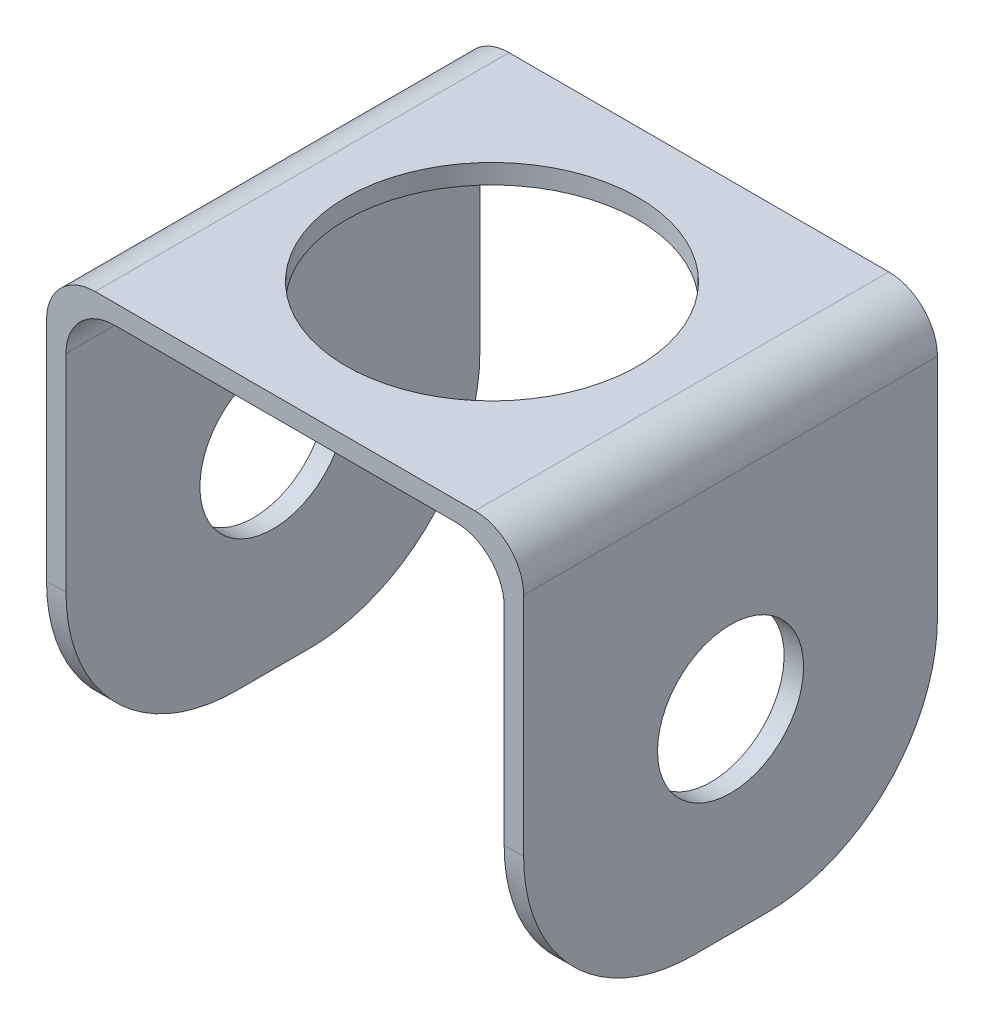
ISO-10303-21;
HEADER;
FILE_DESCRIPTION(('STEP AP214'),'2;1');
FILE_NAME('part.step','',(''),(''),'','','');
FILE_SCHEMA(('AUTOMOTIVE_DESIGN { 1 0 10303 214 1 1 1 1 }'));
ENDSEC;
DATA;
#1=APPLICATION_CONTEXT('core data for automotive mechanical design processes');
#2=APPLICATION_PROTOCOL_DEFINITION('international standard','automotive_design',2000,#1);
#3=PRODUCT_CONTEXT('',#1,'mechanical');
#4=PRODUCT('Part','Part','',(#3));
#5=PRODUCT_RELATED_PRODUCT_CATEGORY('part','',(#4));
#6=PRODUCT_DEFINITION_FORMATION('','',#4);
#7=PRODUCT_DEFINITION_CONTEXT('part definition',#1,'design');
#8=PRODUCT_DEFINITION('design','',#6,#7);
#9=PRODUCT_DEFINITION_SHAPE('','',#8);
#10=(LENGTH_UNIT() NAMED_UNIT(*) SI_UNIT(.MILLI.,.METRE.));
#11=(NAMED_UNIT(*) PLANE_ANGLE_UNIT() SI_UNIT($,.RADIAN.));
#12=(NAMED_UNIT(*) SI_UNIT($,.STERADIAN.) SOLID_ANGLE_UNIT());
#13=UNCERTAINTY_MEASURE_WITH_UNIT(LENGTH_MEASURE(1.E-05),#10,'distance_accuracy_value','');
#14=(GEOMETRIC_REPRESENTATION_CONTEXT(3) GLOBAL_UNCERTAINTY_ASSIGNED_CONTEXT((#13)) GLOBAL_UNIT_ASSIGNED_CONTEXT((#10,
#11,#12)) REPRESENTATION_CONTEXT('',''));
#15=CARTESIAN_POINT('',(0.,0.,0.));
#16=DIRECTION('',(0.,0.,1.));
#17=DIRECTION('',(1.,0.,0.));
#18=AXIS2_PLACEMENT_3D('',#15,#16,#17);
#19=CARTESIAN_POINT('',(-180.,0.,170.));
#20=DIRECTION('',(-1.,0.,0.));
#21=DIRECTION('',(0.,0.,1.));
#22=AXIS2_PLACEMENT_3D('',#19,#20,#21);
#23=PLANE('',#22);
#24=CARTESIAN_POINT('',(-180.,-95.,85.));
#25=DIRECTION('',(-1.,0.,0.));
#26=DIRECTION('',(0.,0.,1.));
#27=AXIS2_PLACEMENT_3D('',#24,#25,#26);
#28=CIRCLE('',#27,30.);
#29=CARTESIAN_POINT('',(-180.,-95.,115.));
#30=VERTEX_POINT('',#29);
#31=EDGE_CURVE('E490',#30,#30,#28,.T.);
#32=ORIENTED_EDGE('',*,*,#31,.T.);
#33=EDGE_LOOP('',(#32));
#34=FACE_BOUND('',#33,.T.);
#35=DIRECTION('',(0.,1.,0.));
#36=VECTOR('',#35,1.);
#37=CARTESIAN_POINT('',(-180.,0.,0.));
#38=LINE('',#37,#36);
#39=CARTESIAN_POINT('',(-180.,-105.,0.));
#40=VERTEX_POINT('',#39);
#41=CARTESIAN_POINT('',(-180.,-20.,0.));
#42=VERTEX_POINT('',#41);
#43=EDGE_CURVE('E193',#40,#42,#38,.T.);
#44=ORIENTED_EDGE('',*,*,#43,.T.);
#45=DIRECTION('',(0.,0.,-1.));
#46=VECTOR('',#45,1.);
#47=CARTESIAN_POINT('',(-180.,-20.,170.));
#48=LINE('',#47,#46);
#49=CARTESIAN_POINT('',(-180.,-20.,170.));
#50=VERTEX_POINT('',#49);
#51=EDGE_CURVE('E173',#42,#50,#48,.F.);
#52=ORIENTED_EDGE('',*,*,#51,.T.);
#53=DIRECTION('',(0.,1.,0.));
#54=VECTOR('',#53,1.);
#55=CARTESIAN_POINT('',(-180.,0.,170.));
#56=LINE('',#55,#54);
#57=CARTESIAN_POINT('',(-180.,-105.,170.));
#58=VERTEX_POINT('',#57);
#59=EDGE_CURVE('E165',#58,#50,#56,.T.);
#60=ORIENTED_EDGE('',*,*,#59,.F.);
#61=CARTESIAN_POINT('',(-180.,-105.,100.));
#62=DIRECTION('',(-1.,0.,0.));
#63=DIRECTION('',(0.,0.,1.));
#64=AXIS2_PLACEMENT_3D('',#61,#62,#63);
#65=CIRCLE('',#64,70.);
#66=CARTESIAN_POINT('',(-180.,-175.,100.));
#67=VERTEX_POINT('',#66);
#68=EDGE_CURVE('E150',#58,#67,#65,.F.);
#69=ORIENTED_EDGE('',*,*,#68,.T.);
#70=DIRECTION('',(0.,0.,-1.));
#71=VECTOR('',#70,1.);
#72=CARTESIAN_POINT('',(-180.,-175.,170.));
#73=LINE('',#72,#71);
#74=CARTESIAN_POINT('',(-180.,-175.,70.));
#75=VERTEX_POINT('',#74);
#76=EDGE_CURVE('E192',#67,#75,#73,.T.);
#77=ORIENTED_EDGE('',*,*,#76,.T.);
#78=CARTESIAN_POINT('',(-180.,-105.,70.));
#79=DIRECTION('',(-1.,0.,0.));
#80=DIRECTION('',(0.,0.,1.));
#81=AXIS2_PLACEMENT_3D('',#78,#79,#80);
#82=CIRCLE('',#81,70.);
#83=EDGE_CURVE('E161',#75,#40,#82,.F.);
#84=ORIENTED_EDGE('',*,*,#83,.T.);
#85=EDGE_LOOP('',(#44,#52,#60,#69,#77,#84));
#86=FACE_BOUND('',#85,.T.);
#87=ADVANCED_FACE('F34',(#34,#86),#23,.F.);
#88=CARTESIAN_POINT('',(-180.,0.,170.));
#89=DIRECTION('',(0.,1.,0.));
#90=DIRECTION('',(0.,0.,1.));
#91=AXIS2_PLACEMENT_3D('',#88,#89,#90);
#92=PLANE('',#91);
#93=CARTESIAN_POINT('',(-90.,0.,85.));
#94=DIRECTION('',(0.,1.,0.));
#95=DIRECTION('',(0.,0.,1.));
#96=AXIS2_PLACEMENT_3D('',#93,#94,#95);
#97=CIRCLE('',#96,60.);
#98=CARTESIAN_POINT('',(-150.,0.,85.));
#99=VERTEX_POINT('',#98);
#100=EDGE_CURVE('E183',#99,#99,#97,.T.);
#101=ORIENTED_EDGE('',*,*,#100,.T.);
#102=EDGE_LOOP('',(#101));
#103=FACE_BOUND('',#102,.T.);
#104=DIRECTION('',(1.,0.,0.));
#105=VECTOR('',#104,1.);
#106=CARTESIAN_POINT('',(-180.,0.,170.));
#107=LINE('',#106,#105);
#108=CARTESIAN_POINT('',(-160.,0.,170.));
#109=VERTEX_POINT('',#108);
#110=CARTESIAN_POINT('',(-20.,0.,170.));
#111=VERTEX_POINT('',#110);
#112=EDGE_CURVE('E174',#109,#111,#107,.T.);
#113=ORIENTED_EDGE('',*,*,#112,.F.);
#114=DIRECTION('',(0.,0.,-1.));
#115=VECTOR('',#114,1.);
#116=CARTESIAN_POINT('',(-160.,0.,0.));
#117=LINE('',#116,#115);
#118=CARTESIAN_POINT('',(-160.,0.,0.));
#119=VERTEX_POINT('',#118);
#120=EDGE_CURVE('E246',#109,#119,#117,.T.);
#121=ORIENTED_EDGE('',*,*,#120,.T.);
#122=DIRECTION('',(1.,0.,0.));
#123=VECTOR('',#122,1.);
#124=CARTESIAN_POINT('',(-180.,0.,0.));
#125=LINE('',#124,#123);
#126=CARTESIAN_POINT('',(-20.,0.,0.));
#127=VERTEX_POINT('',#126);
#128=EDGE_CURVE('E195',#119,#127,#125,.T.);
#129=ORIENTED_EDGE('',*,*,#128,.T.);
#130=DIRECTION('',(0.,0.,-1.));
#131=VECTOR('',#130,1.);
#132=CARTESIAN_POINT('',(-20.,0.,170.));
#133=LINE('',#132,#131);
#134=EDGE_CURVE('E244',#127,#111,#133,.F.);
#135=ORIENTED_EDGE('',*,*,#134,.T.);
#136=EDGE_LOOP('',(#113,#121,#129,#135));
#137=FACE_BOUND('',#136,.T.);
#138=ADVANCED_FACE('F310',(#103,#137),#92,.F.);
#139=CARTESIAN_POINT('',(0.,0.,170.));
#140=DIRECTION('',(1.,0.,0.));
#141=DIRECTION('',(0.,1.,0.));
#142=AXIS2_PLACEMENT_3D('',#139,#140,#141);
#143=PLANE('',#142);
#144=CARTESIAN_POINT('',(0.,-95.,85.));
#145=DIRECTION('',(1.,0.,0.));
#146=DIRECTION('',(0.,1.,0.));
#147=AXIS2_PLACEMENT_3D('',#144,#145,#146);
#148=CIRCLE('',#147,30.);
#149=CARTESIAN_POINT('',(0.,-65.,85.));
#150=VERTEX_POINT('',#149);
#151=EDGE_CURVE('E492',#150,#150,#148,.T.);
#152=ORIENTED_EDGE('',*,*,#151,.T.);
#153=EDGE_LOOP('',(#152));
#154=FACE_BOUND('',#153,.T.);
#155=DIRECTION('',(0.,-1.,0.));
#156=VECTOR('',#155,1.);
#157=CARTESIAN_POINT('',(0.,0.,170.));
#158=LINE('',#157,#156);
#159=CARTESIAN_POINT('',(0.,-20.,170.));
#160=VERTEX_POINT('',#159);
#161=CARTESIAN_POINT('',(0.,-105.,170.));
#162=VERTEX_POINT('',#161);
#163=EDGE_CURVE('E178',#160,#162,#158,.T.);
#164=ORIENTED_EDGE('',*,*,#163,.F.);
#165=DIRECTION('',(0.,0.,-1.));
#166=VECTOR('',#165,1.);
#167=CARTESIAN_POINT('',(0.,-20.,0.));
#168=LINE('',#167,#166);
#169=CARTESIAN_POINT('',(0.,-20.,0.));
#170=VERTEX_POINT('',#169);
#171=EDGE_CURVE('E250',#160,#170,#168,.T.);
#172=ORIENTED_EDGE('',*,*,#171,.T.);
#173=DIRECTION('',(0.,-1.,0.));
#174=VECTOR('',#173,1.);
#175=CARTESIAN_POINT('',(0.,0.,0.));
#176=LINE('',#175,#174);
#177=CARTESIAN_POINT('',(0.,-105.,0.));
#178=VERTEX_POINT('',#177);
#179=EDGE_CURVE('E198',#170,#178,#176,.T.);
#180=ORIENTED_EDGE('',*,*,#179,.T.);
#181=CARTESIAN_POINT('',(0.,-105.,70.));
#182=DIRECTION('',(1.,0.,0.));
#183=DIRECTION('',(0.,1.,0.));
#184=AXIS2_PLACEMENT_3D('',#181,#182,#183);
#185=CIRCLE('',#184,70.);
#186=CARTESIAN_POINT('',(0.,-175.,70.));
#187=VERTEX_POINT('',#186);
#188=EDGE_CURVE('E242',#178,#187,#185,.F.);
#189=ORIENTED_EDGE('',*,*,#188,.T.);
#190=DIRECTION('',(0.,0.,-1.));
#191=VECTOR('',#190,1.);
#192=CARTESIAN_POINT('',(0.,-175.,170.));
#193=LINE('',#192,#191);
#194=CARTESIAN_POINT('',(0.,-175.,100.));
#195=VERTEX_POINT('',#194);
#196=EDGE_CURVE('E211',#195,#187,#193,.T.);
#197=ORIENTED_EDGE('',*,*,#196,.F.);
#198=CARTESIAN_POINT('',(0.,-105.,100.));
#199=DIRECTION('',(1.,0.,0.));
#200=DIRECTION('',(0.,1.,0.));
#201=AXIS2_PLACEMENT_3D('',#198,#199,#200);
#202=CIRCLE('',#201,70.);
#203=EDGE_CURVE('E239',#195,#162,#202,.F.);
#204=ORIENTED_EDGE('',*,*,#203,.T.);
#205=EDGE_LOOP('',(#164,#172,#180,#189,#197,#204));
#206=FACE_BOUND('',#205,.T.);
#207=ADVANCED_FACE('F297',(#154,#206),#143,.F.);
#208=CARTESIAN_POINT('',(0.,-175.,170.));
#209=DIRECTION('',(0.,1.,0.));
#210=DIRECTION('',(0.,0.,1.));
#211=AXIS2_PLACEMENT_3D('',#208,#209,#210);
#212=PLANE('',#211);
#213=ORIENTED_EDGE('',*,*,#196,.T.);
#214=DIRECTION('',(1.,0.,0.));
#215=VECTOR('',#214,1.);
#216=CARTESIAN_POINT('',(8.00000000000002,-175.,70.));
#217=LINE('',#216,#215);
#218=CARTESIAN_POINT('',(8.00000000000002,-175.,70.));
#219=VERTEX_POINT('',#218);
#220=EDGE_CURVE('E232',#187,#219,#217,.T.);
#221=ORIENTED_EDGE('',*,*,#220,.T.);
#222=DIRECTION('',(0.,0.,-1.));
#223=VECTOR('',#222,1.);
#224=CARTESIAN_POINT('',(8.00000000000002,-175.,170.));
#225=LINE('',#224,#223);
#226=CARTESIAN_POINT('',(8.00000000000002,-175.,100.));
#227=VERTEX_POINT('',#226);
#228=EDGE_CURVE('E208',#227,#219,#225,.T.);
#229=ORIENTED_EDGE('',*,*,#228,.F.);
#230=DIRECTION('',(1.,0.,0.));
#231=VECTOR('',#230,1.);
#232=CARTESIAN_POINT('',(0.,-175.,100.));
#233=LINE('',#232,#231);
#234=EDGE_CURVE('E230',#227,#195,#233,.F.);
#235=ORIENTED_EDGE('',*,*,#234,.T.);
#236=EDGE_LOOP('',(#213,#221,#229,#235));
#237=FACE_BOUND('',#236,.T.);
#238=ADVANCED_FACE('F291',(#237),#212,.F.);
#239=CARTESIAN_POINT('',(8.00000000000002,-175.,170.));
#240=DIRECTION('',(-1.,0.,0.));
#241=DIRECTION('',(0.,-1.,0.));
#242=AXIS2_PLACEMENT_3D('',#239,#240,#241);
#243=PLANE('',#242);
#244=CARTESIAN_POINT('',(8.00000000000001,-95.,85.));
#245=DIRECTION('',(-1.,0.,0.));
#246=DIRECTION('',(0.,-1.,0.));
#247=AXIS2_PLACEMENT_3D('',#244,#245,#246);
#248=CIRCLE('',#247,30.);
#249=CARTESIAN_POINT('',(8.00000000000001,-125.,85.));
#250=VERTEX_POINT('',#249);
#251=EDGE_CURVE('E496',#250,#250,#248,.T.);
#252=ORIENTED_EDGE('',*,*,#251,.T.);
#253=EDGE_LOOP('',(#252));
#254=FACE_BOUND('',#253,.T.);
#255=DIRECTION('',(0.,1.,0.));
#256=VECTOR('',#255,1.);
#257=CARTESIAN_POINT('',(8.00000000000002,-175.,0.));
#258=LINE('',#257,#256);
#259=CARTESIAN_POINT('',(8.00000000000002,-105.,0.));
#260=VERTEX_POINT('',#259);
#261=CARTESIAN_POINT('',(8.00000000000001,-12.,0.));
#262=VERTEX_POINT('',#261);
#263=EDGE_CURVE('E200',#260,#262,#258,.T.);
#264=ORIENTED_EDGE('',*,*,#263,.T.);
#265=DIRECTION('',(0.,0.,-1.));
#266=VECTOR('',#265,1.);
#267=CARTESIAN_POINT('',(8.00000000000001,-12.,170.));
#268=LINE('',#267,#266);
#269=CARTESIAN_POINT('',(8.00000000000001,-12.,170.));
#270=VERTEX_POINT('',#269);
#271=EDGE_CURVE('E57',#262,#270,#268,.F.);
#272=ORIENTED_EDGE('',*,*,#271,.T.);
#273=DIRECTION('',(0.,1.,0.));
#274=VECTOR('',#273,1.);
#275=CARTESIAN_POINT('',(8.00000000000002,-175.,170.));
#276=LINE('',#275,#274);
#277=CARTESIAN_POINT('',(8.00000000000002,-105.,170.));
#278=VERTEX_POINT('',#277);
#279=EDGE_CURVE('E187',#278,#270,#276,.T.);
#280=ORIENTED_EDGE('',*,*,#279,.F.);
#281=CARTESIAN_POINT('',(8.00000000000002,-105.,100.));
#282=DIRECTION('',(-1.,0.,0.));
#283=DIRECTION('',(0.,-1.,0.));
#284=AXIS2_PLACEMENT_3D('',#281,#282,#283);
#285=CIRCLE('',#284,70.);
#286=EDGE_CURVE('E235',#278,#227,#285,.F.);
#287=ORIENTED_EDGE('',*,*,#286,.T.);
#288=ORIENTED_EDGE('',*,*,#228,.T.);
#289=CARTESIAN_POINT('',(8.00000000000002,-105.,70.));
#290=DIRECTION('',(-1.,0.,0.));
#291=DIRECTION('',(0.,-1.,0.));
#292=AXIS2_PLACEMENT_3D('',#289,#290,#291);
#293=CIRCLE('',#292,70.);
#294=EDGE_CURVE('E237',#219,#260,#293,.F.);
#295=ORIENTED_EDGE('',*,*,#294,.T.);
#296=EDGE_LOOP('',(#264,#272,#280,#287,#288,#295));
#297=FACE_BOUND('',#296,.T.);
#298=ADVANCED_FACE('F284',(#254,#297),#243,.F.);
#299=CARTESIAN_POINT('',(-180.,7.99999999999998,170.));
#300=DIRECTION('',(0.,-1.,0.));
#301=DIRECTION('',(1.,0.,0.));
#302=AXIS2_PLACEMENT_3D('',#299,#300,#301);
#303=PLANE('',#302);
#304=CARTESIAN_POINT('',(-90.,8.00000000000001,85.));
#305=DIRECTION('',(0.,1.,0.));
#306=DIRECTION('',(-1.,0.,0.));
#307=AXIS2_PLACEMENT_3D('',#304,#305,#306);
#308=CIRCLE('',#307,60.);
#309=CARTESIAN_POINT('',(-150.,8.00000000000004,85.));
#310=VERTEX_POINT('',#309);
#311=EDGE_CURVE('E491',#310,#310,#308,.T.);
#312=ORIENTED_EDGE('',*,*,#311,.F.);
#313=EDGE_LOOP('',(#312));
#314=FACE_BOUND('',#313,.T.);
#315=DIRECTION('',(-1.,0.,0.));
#316=VECTOR('',#315,1.);
#317=CARTESIAN_POINT('',(8.00000000000001,8.00000000000001,170.));
#318=LINE('',#317,#316);
#319=CARTESIAN_POINT('',(-12.,8.00000000000001,170.));
#320=VERTEX_POINT('',#319);
#321=CARTESIAN_POINT('',(-168.,7.99999999999998,170.));
#322=VERTEX_POINT('',#321);
#323=EDGE_CURVE('E189',#320,#322,#318,.T.);
#324=ORIENTED_EDGE('',*,*,#323,.F.);
#325=DIRECTION('',(0.,0.,-1.));
#326=VECTOR('',#325,1.);
#327=CARTESIAN_POINT('',(-12.,8.00000000000002,170.));
#328=LINE('',#327,#326);
#329=CARTESIAN_POINT('',(-12.,8.00000000000002,0.));
#330=VERTEX_POINT('',#329);
#331=EDGE_CURVE('E263',#320,#330,#328,.T.);
#332=ORIENTED_EDGE('',*,*,#331,.T.);
#333=DIRECTION('',(-1.,0.,0.));
#334=VECTOR('',#333,1.);
#335=CARTESIAN_POINT('',(-180.,7.99999999999998,0.));
#336=LINE('',#335,#334);
#337=CARTESIAN_POINT('',(-168.,7.99999999999998,0.));
#338=VERTEX_POINT('',#337);
#339=EDGE_CURVE('E180',#330,#338,#336,.T.);
#340=ORIENTED_EDGE('',*,*,#339,.T.);
#341=DIRECTION('',(0.,0.,-1.));
#342=VECTOR('',#341,1.);
#343=CARTESIAN_POINT('',(-168.,7.99999999999998,170.));
#344=LINE('',#343,#342);
#345=EDGE_CURVE('E261',#338,#322,#344,.F.);
#346=ORIENTED_EDGE('',*,*,#345,.T.);
#347=EDGE_LOOP('',(#324,#332,#340,#346));
#348=FACE_BOUND('',#347,.T.);
#349=ADVANCED_FACE('F276',(#314,#348),#303,.F.);
#350=CARTESIAN_POINT('',(-188.,7.99999999999998,170.));
#351=DIRECTION('',(1.,0.,0.));
#352=DIRECTION('',(0.,1.,0.));
#353=AXIS2_PLACEMENT_3D('',#350,#351,#352);
#354=PLANE('',#353);
#355=CARTESIAN_POINT('',(-188.,-95.,85.));
#356=DIRECTION('',(1.,0.,0.));
#357=DIRECTION('',(0.,1.,0.));
#358=AXIS2_PLACEMENT_3D('',#355,#356,#357);
#359=CIRCLE('',#358,30.);
#360=CARTESIAN_POINT('',(-188.,-65.,85.));
#361=VERTEX_POINT('',#360);
#362=EDGE_CURVE('E488',#361,#361,#359,.T.);
#363=ORIENTED_EDGE('',*,*,#362,.T.);
#364=EDGE_LOOP('',(#363));
#365=FACE_BOUND('',#364,.T.);
#366=DIRECTION('',(0.,-1.,0.));
#367=VECTOR('',#366,1.);
#368=CARTESIAN_POINT('',(-188.,7.99999999999998,170.));
#369=LINE('',#368,#367);
#370=CARTESIAN_POINT('',(-188.,-12.,170.));
#371=VERTEX_POINT('',#370);
#372=CARTESIAN_POINT('',(-188.,-105.,170.));
#373=VERTEX_POINT('',#372);
#374=EDGE_CURVE('E167',#371,#373,#369,.T.);
#375=ORIENTED_EDGE('',*,*,#374,.F.);
#376=DIRECTION('',(0.,0.,-1.));
#377=VECTOR('',#376,1.);
#378=CARTESIAN_POINT('',(-188.,-12.,170.));
#379=LINE('',#378,#377);
#380=CARTESIAN_POINT('',(-188.,-12.,0.));
#381=VERTEX_POINT('',#380);
#382=EDGE_CURVE('E11',#371,#381,#379,.T.);
#383=ORIENTED_EDGE('',*,*,#382,.T.);
#384=DIRECTION('',(0.,-1.,0.));
#385=VECTOR('',#384,1.);
#386=CARTESIAN_POINT('',(-188.,7.99999999999998,0.));
#387=LINE('',#386,#385);
#388=CARTESIAN_POINT('',(-188.,-105.,0.));
#389=VERTEX_POINT('',#388);
#390=EDGE_CURVE('E175',#381,#389,#387,.T.);
#391=ORIENTED_EDGE('',*,*,#390,.T.);
#392=CARTESIAN_POINT('',(-188.,-105.,70.));
#393=DIRECTION('',(1.,0.,0.));
#394=DIRECTION('',(0.,1.,0.));
#395=AXIS2_PLACEMENT_3D('',#392,#393,#394);
#396=CIRCLE('',#395,70.);
#397=CARTESIAN_POINT('',(-188.,-175.,70.));
#398=VERTEX_POINT('',#397);
#399=EDGE_CURVE('E220',#389,#398,#396,.F.);
#400=ORIENTED_EDGE('',*,*,#399,.T.);
#401=DIRECTION('',(0.,0.,-1.));
#402=VECTOR('',#401,1.);
#403=CARTESIAN_POINT('',(-188.,-175.,170.));
#404=LINE('',#403,#402);
#405=CARTESIAN_POINT('',(-188.,-175.,100.));
#406=VERTEX_POINT('',#405);
#407=EDGE_CURVE('E205',#406,#398,#404,.T.);
#408=ORIENTED_EDGE('',*,*,#407,.F.);
#409=CARTESIAN_POINT('',(-188.,-105.,100.));
#410=DIRECTION('',(1.,0.,0.));
#411=DIRECTION('',(0.,1.,0.));
#412=AXIS2_PLACEMENT_3D('',#409,#410,#411);
#413=CIRCLE('',#412,70.);
#414=EDGE_CURVE('E222',#406,#373,#413,.F.);
#415=ORIENTED_EDGE('',*,*,#414,.T.);
#416=EDGE_LOOP('',(#375,#383,#391,#400,#408,#415));
#417=FACE_BOUND('',#416,.T.);
#418=ADVANCED_FACE('F324',(#365,#417),#354,.F.);
#419=CARTESIAN_POINT('',(-180.,-175.,170.));
#420=DIRECTION('',(0.,1.,0.));
#421=DIRECTION('',(0.,0.,1.));
#422=AXIS2_PLACEMENT_3D('',#419,#420,#421);
#423=PLANE('',#422);
#424=ORIENTED_EDGE('',*,*,#76,.F.);
#425=DIRECTION('',(1.,0.,0.));
#426=VECTOR('',#425,1.);
#427=CARTESIAN_POINT('',(-180.,-175.,100.));
#428=LINE('',#427,#426);
#429=EDGE_CURVE('E155',#67,#406,#428,.F.);
#430=ORIENTED_EDGE('',*,*,#429,.T.);
#431=ORIENTED_EDGE('',*,*,#407,.T.);
#432=DIRECTION('',(1.,0.,0.));
#433=VECTOR('',#432,1.);
#434=CARTESIAN_POINT('',(-180.,-175.,70.));
#435=LINE('',#434,#433);
#436=EDGE_CURVE('E160',#398,#75,#435,.T.);
#437=ORIENTED_EDGE('',*,*,#436,.T.);
#438=EDGE_LOOP('',(#424,#430,#431,#437));
#439=FACE_BOUND('',#438,.T.);
#440=ADVANCED_FACE('F321',(#439),#423,.F.);
#441=CARTESIAN_POINT('',(0.,0.,170.));
#442=DIRECTION('',(0.,0.,-1.));
#443=DIRECTION('',(-1.,0.,0.));
#444=AXIS2_PLACEMENT_3D('',#441,#442,#443);
#445=PLANE('',#444);
#446=ORIENTED_EDGE('',*,*,#279,.T.);
#447=CARTESIAN_POINT('',(-12.,-12.,170.));
#448=DIRECTION('',(0.,0.,-1.));
#449=DIRECTION('',(-1.,0.,0.));
#450=AXIS2_PLACEMENT_3D('',#447,#448,#449);
#451=CIRCLE('',#450,20.);
#452=EDGE_CURVE('E42',#270,#320,#451,.F.);
#453=ORIENTED_EDGE('',*,*,#452,.T.);
#454=ORIENTED_EDGE('',*,*,#323,.T.);
#455=CARTESIAN_POINT('',(-168.,-12.,170.));
#456=DIRECTION('',(0.,0.,-1.));
#457=DIRECTION('',(-1.,0.,0.));
#458=AXIS2_PLACEMENT_3D('',#455,#456,#457);
#459=CIRCLE('',#458,20.);
#460=EDGE_CURVE('E49',#322,#371,#459,.F.);
#461=ORIENTED_EDGE('',*,*,#460,.T.);
#462=ORIENTED_EDGE('',*,*,#374,.T.);
#463=DIRECTION('',(1.,0.,0.));
#464=VECTOR('',#463,1.);
#465=CARTESIAN_POINT('',(0.,-105.,170.));
#466=LINE('',#465,#464);
#467=EDGE_CURVE('E154',#373,#58,#466,.T.);
#468=ORIENTED_EDGE('',*,*,#467,.T.);
#469=ORIENTED_EDGE('',*,*,#59,.T.);
#470=CARTESIAN_POINT('',(-160.,-20.,170.));
#471=DIRECTION('',(0.,0.,-1.));
#472=DIRECTION('',(-1.,0.,0.));
#473=AXIS2_PLACEMENT_3D('',#470,#471,#472);
#474=CIRCLE('',#473,20.);
#475=EDGE_CURVE('E255',#50,#109,#474,.T.);
#476=ORIENTED_EDGE('',*,*,#475,.T.);
#477=ORIENTED_EDGE('',*,*,#112,.T.);
#478=CARTESIAN_POINT('',(-20.,-20.,170.));
#479=DIRECTION('',(0.,0.,-1.));
#480=DIRECTION('',(-1.,0.,0.));
#481=AXIS2_PLACEMENT_3D('',#478,#479,#480);
#482=CIRCLE('',#481,20.);
#483=EDGE_CURVE('E259',#111,#160,#482,.T.);
#484=ORIENTED_EDGE('',*,*,#483,.T.);
#485=ORIENTED_EDGE('',*,*,#163,.T.);
#486=DIRECTION('',(1.,0.,0.));
#487=VECTOR('',#486,1.);
#488=CARTESIAN_POINT('',(0.,-105.,170.));
#489=LINE('',#488,#487);
#490=EDGE_CURVE('E169',#162,#278,#489,.T.);
#491=ORIENTED_EDGE('',*,*,#490,.T.);
#492=EDGE_LOOP('',(#446,#453,#454,#461,#462,#468,#469,#476,#477,#484,#485,#491));
#493=FACE_BOUND('',#492,.T.);
#494=ADVANCED_FACE('F164',(#493),#445,.F.);
#495=CARTESIAN_POINT('',(0.,0.,0.));
#496=DIRECTION('',(0.,0.,-1.));
#497=DIRECTION('',(-1.,0.,0.));
#498=AXIS2_PLACEMENT_3D('',#495,#496,#497);
#499=PLANE('',#498);
#500=ORIENTED_EDGE('',*,*,#339,.F.);
#501=CARTESIAN_POINT('',(-12.,-12.,0.));
#502=DIRECTION('',(0.,0.,-1.));
#503=DIRECTION('',(-1.,0.,0.));
#504=AXIS2_PLACEMENT_3D('',#501,#502,#503);
#505=CIRCLE('',#504,20.);
#506=EDGE_CURVE('E268',#330,#262,#505,.T.);
#507=ORIENTED_EDGE('',*,*,#506,.T.);
#508=ORIENTED_EDGE('',*,*,#263,.F.);
#509=DIRECTION('',(1.,0.,0.));
#510=VECTOR('',#509,1.);
#511=CARTESIAN_POINT('',(0.,-105.,0.));
#512=LINE('',#511,#510);
#513=EDGE_CURVE('E224',#260,#178,#512,.F.);
#514=ORIENTED_EDGE('',*,*,#513,.T.);
#515=ORIENTED_EDGE('',*,*,#179,.F.);
#516=CARTESIAN_POINT('',(-20.,-20.,0.));
#517=DIRECTION('',(0.,0.,-1.));
#518=DIRECTION('',(-1.,0.,0.));
#519=AXIS2_PLACEMENT_3D('',#516,#517,#518);
#520=CIRCLE('',#519,20.);
#521=EDGE_CURVE('E257',#170,#127,#520,.F.);
#522=ORIENTED_EDGE('',*,*,#521,.T.);
#523=ORIENTED_EDGE('',*,*,#128,.F.);
#524=CARTESIAN_POINT('',(-160.,-20.,0.));
#525=DIRECTION('',(0.,0.,-1.));
#526=DIRECTION('',(-1.,0.,0.));
#527=AXIS2_PLACEMENT_3D('',#524,#525,#526);
#528=CIRCLE('',#527,20.);
#529=EDGE_CURVE('E253',#119,#42,#528,.F.);
#530=ORIENTED_EDGE('',*,*,#529,.T.);
#531=ORIENTED_EDGE('',*,*,#43,.F.);
#532=DIRECTION('',(1.,0.,0.));
#533=VECTOR('',#532,1.);
#534=CARTESIAN_POINT('',(-188.,-105.,0.));
#535=LINE('',#534,#533);
#536=EDGE_CURVE('E227',#40,#389,#535,.F.);
#537=ORIENTED_EDGE('',*,*,#536,.T.);
#538=ORIENTED_EDGE('',*,*,#390,.F.);
#539=CARTESIAN_POINT('',(-168.,-12.,0.));
#540=DIRECTION('',(0.,0.,-1.));
#541=DIRECTION('',(-1.,0.,0.));
#542=AXIS2_PLACEMENT_3D('',#539,#540,#541);
#543=CIRCLE('',#542,20.);
#544=EDGE_CURVE('E266',#381,#338,#543,.T.);
#545=ORIENTED_EDGE('',*,*,#544,.T.);
#546=EDGE_LOOP('',(#500,#507,#508,#514,#515,#522,#523,#530,#531,#537,#538,#545));
#547=FACE_BOUND('',#546,.T.);
#548=ADVANCED_FACE('F282',(#547),#499,.T.);
#549=CARTESIAN_POINT('',(-90.,-172.,85.));
#550=DIRECTION('',(0.,1.,0.));
#551=DIRECTION('',(-1.,0.,0.));
#552=AXIS2_PLACEMENT_3D('',#549,#550,#551);
#553=CYLINDRICAL_SURFACE('',#552,60.);
#554=CARTESIAN_POINT('',(-150.,8.00000000000004,85.));
#555=CARTESIAN_POINT('',(-150.,7.9166666666667,85.));
#556=CARTESIAN_POINT('',(-150.,7.83333333333337,85.));
#557=CARTESIAN_POINT('',(-150.,7.6666666666667,85.));
#558=CARTESIAN_POINT('',(-150.,7.58333333333337,85.));
#559=CARTESIAN_POINT('',(-150.,7.4166666666667,85.));
#560=CARTESIAN_POINT('',(-150.,7.33333333333337,85.));
#561=CARTESIAN_POINT('',(-150.,7.1666666666667,85.));
#562=CARTESIAN_POINT('',(-150.,7.08333333333337,85.));
#563=CARTESIAN_POINT('',(-150.,6.9166666666667,85.));
#564=CARTESIAN_POINT('',(-150.,6.83333333333337,85.));
#565=CARTESIAN_POINT('',(-150.,6.6666666666667,85.));
#566=CARTESIAN_POINT('',(-150.,6.58333333333337,85.));
#567=CARTESIAN_POINT('',(-150.,6.4166666666667,85.));
#568=CARTESIAN_POINT('',(-150.,6.33333333333337,85.));
#569=CARTESIAN_POINT('',(-150.,6.1666666666667,85.));
#570=CARTESIAN_POINT('',(-150.,6.08333333333337,85.));
#571=CARTESIAN_POINT('',(-150.,5.91666666666669,85.));
#572=CARTESIAN_POINT('',(-150.,5.83333333333335,85.));
#573=CARTESIAN_POINT('',(-150.,5.66666666666667,85.));
#574=CARTESIAN_POINT('',(-150.,5.58333333333334,85.));
#575=CARTESIAN_POINT('',(-150.,5.41666666666667,85.));
#576=CARTESIAN_POINT('',(-150.,5.33333333333334,85.));
#577=CARTESIAN_POINT('',(-150.,5.16666666666667,85.));
#578=CARTESIAN_POINT('',(-150.,5.08333333333334,85.));
#579=CARTESIAN_POINT('',(-150.,4.91666666666667,85.));
#580=CARTESIAN_POINT('',(-150.,4.83333333333334,85.));
#581=CARTESIAN_POINT('',(-150.,4.66666666666667,85.));
#582=CARTESIAN_POINT('',(-150.,4.58333333333334,85.));
#583=CARTESIAN_POINT('',(-150.,4.41666666666667,85.));
#584=CARTESIAN_POINT('',(-150.,4.33333333333334,85.));
#585=CARTESIAN_POINT('',(-150.,4.16666666666667,85.));
#586=CARTESIAN_POINT('',(-150.,4.08333333333334,85.));
#587=CARTESIAN_POINT('',(-150.,3.91666666666667,85.));
#588=CARTESIAN_POINT('',(-150.,3.83333333333334,85.));
#589=CARTESIAN_POINT('',(-150.,3.66666666666667,85.));
#590=CARTESIAN_POINT('',(-150.,3.58333333333334,85.));
#591=CARTESIAN_POINT('',(-150.,3.41666666666667,85.));
#592=CARTESIAN_POINT('',(-150.,3.33333333333334,85.));
#593=CARTESIAN_POINT('',(-150.,3.16666666666667,85.));
#594=CARTESIAN_POINT('',(-150.,3.08333333333334,85.));
#595=CARTESIAN_POINT('',(-150.,2.91666666666667,85.));
#596=CARTESIAN_POINT('',(-150.,2.83333333333334,85.));
#597=CARTESIAN_POINT('',(-150.,2.66666666666667,85.));
#598=CARTESIAN_POINT('',(-150.,2.58333333333334,85.));
#599=CARTESIAN_POINT('',(-150.,2.41666666666667,85.));
#600=CARTESIAN_POINT('',(-150.,2.33333333333334,85.));
#601=CARTESIAN_POINT('',(-150.,2.16666666666666,85.));
#602=CARTESIAN_POINT('',(-150.,2.08333333333332,85.));
#603=CARTESIAN_POINT('',(-150.,1.91666666666664,85.));
#604=CARTESIAN_POINT('',(-150.,1.83333333333331,85.));
#605=CARTESIAN_POINT('',(-150.,1.66666666666664,85.));
#606=CARTESIAN_POINT('',(-150.,1.58333333333331,85.));
#607=CARTESIAN_POINT('',(-150.,1.41666666666664,85.));
#608=CARTESIAN_POINT('',(-150.,1.33333333333331,85.));
#609=CARTESIAN_POINT('',(-150.,1.16666666666664,85.));
#610=CARTESIAN_POINT('',(-150.,1.08333333333331,85.));
#611=CARTESIAN_POINT('',(-150.,0.91666666666664,85.));
#612=CARTESIAN_POINT('',(-150.,0.833333333333306,85.));
#613=CARTESIAN_POINT('',(-150.,0.66666666666664,85.));
#614=CARTESIAN_POINT('',(-150.,0.583333333333306,85.));
#615=CARTESIAN_POINT('',(-150.,0.416666666666639,85.));
#616=CARTESIAN_POINT('',(-150.,0.333333333333306,85.));
#617=CARTESIAN_POINT('',(-150.,0.166666666666639,85.));
#618=CARTESIAN_POINT('',(-150.,0.0833333333333056,85.));
#619=CARTESIAN_POINT('',(-150.,0.,85.));
#620=B_SPLINE_CURVE_WITH_KNOTS('',3,(#554,#555,#556,#557,#558,#559,#560,#561,#562,#563,#564,
#565,#566,#567,#568,#569,#570,#571,#572,#573,#574,#575,#576,#577,#578,#579,#580,#581,#582,#583,
#584,#585,#586,#587,#588,#589,#590,#591,#592,#593,#594,#595,#596,#597,#598,#599,#600,#601,#602,
#603,#604,#605,#606,#607,#608,#609,#610,#611,#612,#613,#614,#615,#616,#617,#618,#619),
.UNSPECIFIED.,.F.,.F.,(4,2,2,2,2,2,2,2,2,2,2,2,2,2,2,2,2,2,2,2,2,2,2,2,2,2,2,2,2,2,2,2,4),(0.,
0.25,0.5,0.750000000000001,1.,1.25,1.5,1.75,2.,2.25000000000003,2.50000000000003,
2.75000000000003,3.00000000000003,3.25000000000003,3.50000000000003,3.75000000000003,
4.00000000000003,4.25000000000003,4.50000000000003,4.75000000000003,5.00000000000003,
5.25000000000003,5.50000000000003,5.75000000000003,6.00000000000006,6.25000000000006,
6.50000000000006,6.75000000000006,7.00000000000006,7.25000000000006,7.50000000000006,
7.75000000000006,8.00000000000006),.UNSPECIFIED.);
#621=EDGE_CURVE('BSEAM377',#310,#99,#620,.T.);
#622=ORIENTED_EDGE('',*,*,#311,.T.);
#623=ORIENTED_EDGE('',*,*,#100,.F.);
#624=ORIENTED_EDGE('',*,*,#621,.T.);
#625=ORIENTED_EDGE('',*,*,#621,.F.);
#626=EDGE_LOOP('',(#622,#624,#623,#625));
#627=FACE_BOUND('',#626,.T.);
#628=ADVANCED_FACE('F377',(#627),#553,.F.);
#629=CARTESIAN_POINT('',(-188.,-95.,85.));
#630=DIRECTION('',(1.,0.,0.));
#631=DIRECTION('',(0.,1.,0.));
#632=AXIS2_PLACEMENT_3D('',#629,#630,#631);
#633=CYLINDRICAL_SURFACE('',#632,30.);
#634=ORIENTED_EDGE('',*,*,#362,.F.);
#635=EDGE_LOOP('',(#634));
#636=FACE_BOUND('',#635,.T.);
#637=ORIENTED_EDGE('',*,*,#31,.F.);
#638=EDGE_LOOP('',(#637));
#639=FACE_BOUND('',#638,.T.);
#640=ADVANCED_FACE('F478',(#636,#639),#633,.F.);
#641=ORIENTED_EDGE('',*,*,#251,.F.);
#642=EDGE_LOOP('',(#641));
#643=FACE_BOUND('',#642,.T.);
#644=ORIENTED_EDGE('',*,*,#151,.F.);
#645=EDGE_LOOP('',(#644));
#646=FACE_BOUND('',#645,.T.);
#647=ADVANCED_FACE('F345',(#643,#646),#633,.F.);
#648=CARTESIAN_POINT('',(0.,-105.,100.));
#649=DIRECTION('',(1.,0.,0.));
#650=DIRECTION('',(0.,0.,-1.));
#651=AXIS2_PLACEMENT_3D('',#648,#649,#650);
#652=CYLINDRICAL_SURFACE('',#651,70.);
#653=ORIENTED_EDGE('',*,*,#414,.F.);
#654=ORIENTED_EDGE('',*,*,#429,.F.);
#655=ORIENTED_EDGE('',*,*,#68,.F.);
#656=ORIENTED_EDGE('',*,*,#467,.F.);
#657=EDGE_LOOP('',(#653,#654,#655,#656));
#658=FACE_BOUND('',#657,.T.);
#659=ADVANCED_FACE('F153',(#658),#652,.T.);
#660=CARTESIAN_POINT('',(-180.,-105.,70.));
#661=DIRECTION('',(-1.,0.,0.));
#662=DIRECTION('',(0.,0.,1.));
#663=AXIS2_PLACEMENT_3D('',#660,#661,#662);
#664=CYLINDRICAL_SURFACE('',#663,70.);
#665=ORIENTED_EDGE('',*,*,#399,.F.);
#666=ORIENTED_EDGE('',*,*,#536,.F.);
#667=ORIENTED_EDGE('',*,*,#83,.F.);
#668=ORIENTED_EDGE('',*,*,#436,.F.);
#669=EDGE_LOOP('',(#665,#666,#667,#668));
#670=FACE_BOUND('',#669,.T.);
#671=ADVANCED_FACE('F319',(#670),#664,.T.);
#672=CARTESIAN_POINT('',(0.,-105.,70.));
#673=DIRECTION('',(-1.,0.,0.));
#674=DIRECTION('',(0.,0.,1.));
#675=AXIS2_PLACEMENT_3D('',#672,#673,#674);
#676=CYLINDRICAL_SURFACE('',#675,70.);
#677=ORIENTED_EDGE('',*,*,#188,.F.);
#678=ORIENTED_EDGE('',*,*,#513,.F.);
#679=ORIENTED_EDGE('',*,*,#294,.F.);
#680=ORIENTED_EDGE('',*,*,#220,.F.);
#681=EDGE_LOOP('',(#677,#678,#679,#680));
#682=FACE_BOUND('',#681,.T.);
#683=ADVANCED_FACE('F289',(#682),#676,.T.);
#684=CARTESIAN_POINT('',(0.,-105.,100.));
#685=DIRECTION('',(1.,0.,0.));
#686=DIRECTION('',(0.,0.,-1.));
#687=AXIS2_PLACEMENT_3D('',#684,#685,#686);
#688=CYLINDRICAL_SURFACE('',#687,70.);
#689=ORIENTED_EDGE('',*,*,#203,.F.);
#690=ORIENTED_EDGE('',*,*,#234,.F.);
#691=ORIENTED_EDGE('',*,*,#286,.F.);
#692=ORIENTED_EDGE('',*,*,#490,.F.);
#693=EDGE_LOOP('',(#689,#690,#691,#692));
#694=FACE_BOUND('',#693,.T.);
#695=ADVANCED_FACE('F300',(#694),#688,.T.);
#696=CARTESIAN_POINT('',(-160.,-20.,170.));
#697=DIRECTION('',(0.,0.,1.));
#698=DIRECTION('',(1.,0.,0.));
#699=AXIS2_PLACEMENT_3D('',#696,#697,#698);
#700=CYLINDRICAL_SURFACE('',#699,20.);
#701=ORIENTED_EDGE('',*,*,#475,.F.);
#702=ORIENTED_EDGE('',*,*,#51,.F.);
#703=ORIENTED_EDGE('',*,*,#529,.F.);
#704=ORIENTED_EDGE('',*,*,#120,.F.);
#705=EDGE_LOOP('',(#701,#702,#703,#704));
#706=FACE_BOUND('',#705,.T.);
#707=ADVANCED_FACE('F313',(#706),#700,.F.);
#708=CARTESIAN_POINT('',(-20.,-20.,170.));
#709=DIRECTION('',(0.,0.,1.));
#710=DIRECTION('',(1.,0.,0.));
#711=AXIS2_PLACEMENT_3D('',#708,#709,#710);
#712=CYLINDRICAL_SURFACE('',#711,20.);
#713=ORIENTED_EDGE('',*,*,#483,.F.);
#714=ORIENTED_EDGE('',*,*,#134,.F.);
#715=ORIENTED_EDGE('',*,*,#521,.F.);
#716=ORIENTED_EDGE('',*,*,#171,.F.);
#717=EDGE_LOOP('',(#713,#714,#715,#716));
#718=FACE_BOUND('',#717,.T.);
#719=ADVANCED_FACE('F305',(#718),#712,.F.);
#720=CARTESIAN_POINT('',(-12.,-12.,170.));
#721=DIRECTION('',(0.,0.,-1.));
#722=DIRECTION('',(-1.,0.,0.));
#723=AXIS2_PLACEMENT_3D('',#720,#721,#722);
#724=CYLINDRICAL_SURFACE('',#723,20.);
#725=ORIENTED_EDGE('',*,*,#452,.F.);
#726=ORIENTED_EDGE('',*,*,#271,.F.);
#727=ORIENTED_EDGE('',*,*,#506,.F.);
#728=ORIENTED_EDGE('',*,*,#331,.F.);
#729=EDGE_LOOP('',(#725,#726,#727,#728));
#730=FACE_BOUND('',#729,.T.);
#731=ADVANCED_FACE('F279',(#730),#724,.T.);
#732=CARTESIAN_POINT('',(-168.,-12.,170.));
#733=DIRECTION('',(0.,0.,-1.));
#734=DIRECTION('',(-1.,0.,0.));
#735=AXIS2_PLACEMENT_3D('',#732,#733,#734);
#736=CYLINDRICAL_SURFACE('',#735,20.);
#737=ORIENTED_EDGE('',*,*,#460,.F.);
#738=ORIENTED_EDGE('',*,*,#345,.F.);
#739=ORIENTED_EDGE('',*,*,#544,.F.);
#740=ORIENTED_EDGE('',*,*,#382,.F.);
#741=EDGE_LOOP('',(#737,#738,#739,#740));
#742=FACE_BOUND('',#741,.T.);
#743=ADVANCED_FACE('F36',(#742),#736,.T.);
#744=CLOSED_SHELL('',(#87,#138,#207,#238,#298,#349,#418,#440,#494,#548,#628,#640,#647,#659,#671,
#683,#695,#707,#719,#731,#743));
#745=MANIFOLD_SOLID_BREP('B2',#744);
#746=ADVANCED_BREP_SHAPE_REPRESENTATION('',(#18,#745),#14);
#747=SHAPE_DEFINITION_REPRESENTATION(#9,#746);
ENDSEC;
END-ISO-10303-21;
